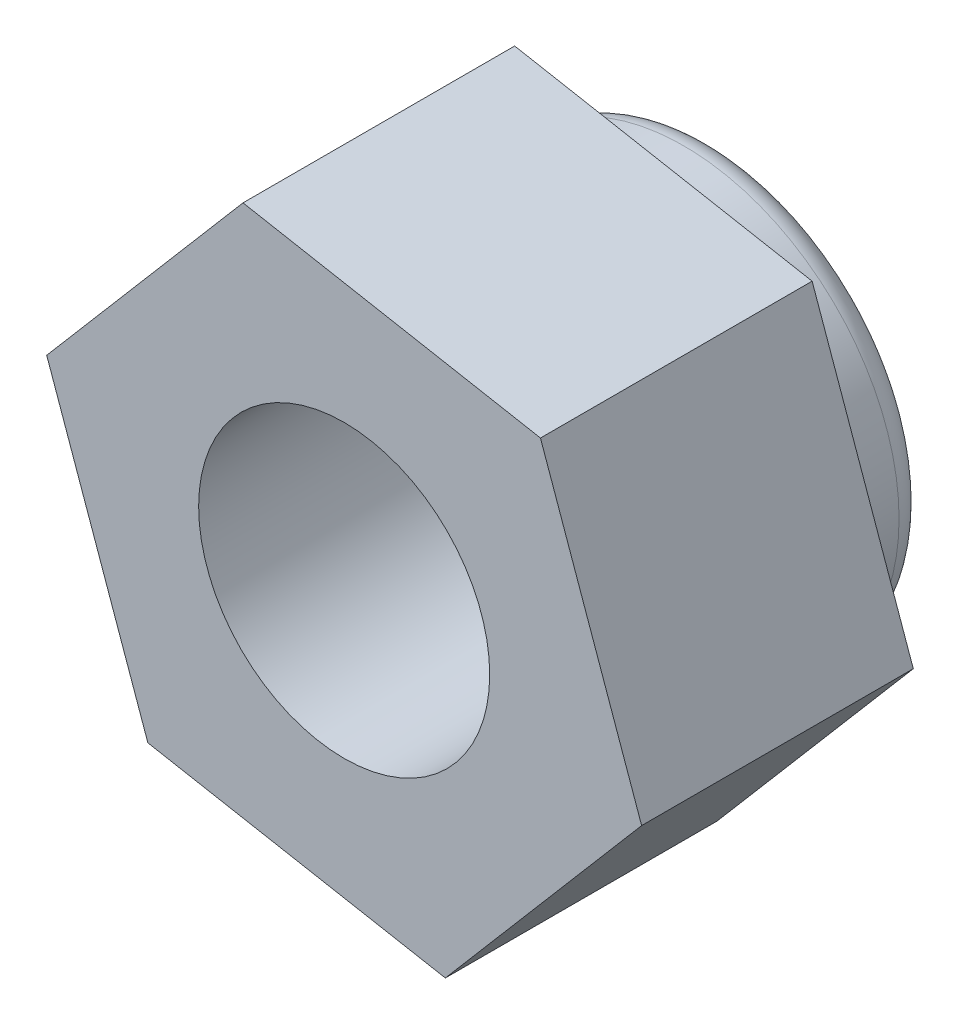
ISO-10303-21;
HEADER;
FILE_DESCRIPTION(('STEP AP214'),'2;1');
FILE_NAME('part.step','',(''),(''),'','','');
FILE_SCHEMA(('AUTOMOTIVE_DESIGN { 1 0 10303 214 1 1 1 1 }'));
ENDSEC;
DATA;
#1=APPLICATION_CONTEXT('core data for automotive mechanical design processes');
#2=APPLICATION_PROTOCOL_DEFINITION('international standard','automotive_design',2000,#1);
#3=PRODUCT_CONTEXT('',#1,'mechanical');
#4=PRODUCT('Part','Part','',(#3));
#5=PRODUCT_RELATED_PRODUCT_CATEGORY('part','',(#4));
#6=PRODUCT_DEFINITION_FORMATION('','',#4);
#7=PRODUCT_DEFINITION_CONTEXT('part definition',#1,'design');
#8=PRODUCT_DEFINITION('design','',#6,#7);
#9=PRODUCT_DEFINITION_SHAPE('','',#8);
#10=(LENGTH_UNIT() NAMED_UNIT(*) SI_UNIT(.MILLI.,.METRE.));
#11=(NAMED_UNIT(*) PLANE_ANGLE_UNIT() SI_UNIT($,.RADIAN.));
#12=(NAMED_UNIT(*) SI_UNIT($,.STERADIAN.) SOLID_ANGLE_UNIT());
#13=UNCERTAINTY_MEASURE_WITH_UNIT(LENGTH_MEASURE(1.E-05),#10,'distance_accuracy_value','');
#14=(GEOMETRIC_REPRESENTATION_CONTEXT(3) GLOBAL_UNCERTAINTY_ASSIGNED_CONTEXT((#13)) GLOBAL_UNIT_ASSIGNED_CONTEXT((#10,
#11,#12)) REPRESENTATION_CONTEXT('',''));
#15=CARTESIAN_POINT('',(0.,0.,0.));
#16=DIRECTION('',(0.,0.,1.));
#17=DIRECTION('',(1.,0.,0.));
#18=AXIS2_PLACEMENT_3D('',#15,#16,#17);
#19=CARTESIAN_POINT('',(0.,0.,0.));
#20=DIRECTION('',(0.,0.,1.));
#21=DIRECTION('',(1.,0.,0.));
#22=AXIS2_PLACEMENT_3D('',#19,#20,#21);
#23=PLANE('',#22);
#24=CARTESIAN_POINT('',(0.,0.,0.));
#25=DIRECTION('',(0.,0.,1.));
#26=DIRECTION('',(1.,0.,0.));
#27=AXIS2_PLACEMENT_3D('',#24,#25,#26);
#28=CIRCLE('',#27,1.91923847399192);
#29=CARTESIAN_POINT('',(1.91923847399192,0.,0.));
#30=VERTEX_POINT('',#29);
#31=EDGE_CURVE('E47',#30,#30,#28,.F.);
#32=ORIENTED_EDGE('',*,*,#31,.T.);
#33=EDGE_LOOP('',(#32));
#34=FACE_BOUND('',#33,.T.);
#35=CARTESIAN_POINT('',(0.,0.,0.));
#36=DIRECTION('',(0.,0.,1.));
#37=DIRECTION('',(1.,0.,0.));
#38=AXIS2_PLACEMENT_3D('',#35,#36,#37);
#39=CIRCLE('',#38,1.5);
#40=CARTESIAN_POINT('',(-1.5,0.,0.));
#41=VERTEX_POINT('',#40);
#42=EDGE_CURVE('E193',#41,#41,#39,.T.);
#43=ORIENTED_EDGE('',*,*,#42,.T.);
#44=EDGE_LOOP('',(#43));
#45=FACE_BOUND('',#44,.T.);
#46=ADVANCED_FACE('F39',(#34,#45),#23,.F.);
#47=CARTESIAN_POINT('',(2.0231883099042,2.3720685198086,3.8));
#48=DIRECTION('',(-0.181576086515687,-0.983376898653638,0.));
#49=DIRECTION('',(0.983376898653638,-0.181576086515687,0.));
#50=AXIS2_PLACEMENT_3D('',#47,#48,#49);
#51=PLANE('',#50);
#52=DIRECTION('',(0.983376898653638,-0.181576086515687,0.));
#53=VECTOR('',#52,1.);
#54=CARTESIAN_POINT('',(2.0231883099042,2.3720685198086,1.));
#55=LINE('',#54,#53);
#56=CARTESIAN_POINT('',(-1.0426774427195,2.93816673292105,1.));
#57=VERTEX_POINT('',#56);
#58=CARTESIAN_POINT('',(2.0231883099042,2.3720685198086,1.));
#59=VERTEX_POINT('',#58);
#60=EDGE_CURVE('E54',#57,#59,#55,.T.);
#61=ORIENTED_EDGE('',*,*,#60,.F.);
#62=DIRECTION('',(0.,0.,-1.));
#63=VECTOR('',#62,1.);
#64=CARTESIAN_POINT('',(-1.0426774427195,2.93816673292105,3.8));
#65=LINE('',#64,#63);
#66=CARTESIAN_POINT('',(-1.0426774427195,2.93816673292105,3.8));
#67=VERTEX_POINT('',#66);
#68=EDGE_CURVE('E98',#67,#57,#65,.T.);
#69=ORIENTED_EDGE('',*,*,#68,.F.);
#70=DIRECTION('',(-0.983376898653638,0.181576086515687,0.));
#71=VECTOR('',#70,1.);
#72=CARTESIAN_POINT('',(2.0231883099042,2.3720685198086,3.8));
#73=LINE('',#72,#71);
#74=CARTESIAN_POINT('',(2.0231883099042,2.3720685198086,3.8));
#75=VERTEX_POINT('',#74);
#76=EDGE_CURVE('E183',#75,#67,#73,.T.);
#77=ORIENTED_EDGE('',*,*,#76,.F.);
#78=DIRECTION('',(0.,0.,-1.));
#79=VECTOR('',#78,1.);
#80=CARTESIAN_POINT('',(2.0231883099042,2.3720685198086,3.8));
#81=LINE('',#80,#79);
#82=EDGE_CURVE('E112',#75,#59,#81,.T.);
#83=ORIENTED_EDGE('',*,*,#82,.T.);
#84=EDGE_LOOP('',(#61,#69,#77,#83));
#85=FACE_BOUND('',#84,.T.);
#86=ADVANCED_FACE('F140',(#85),#51,.F.);
#87=CARTESIAN_POINT('',(-1.0426774427195,2.93816673292105,3.8));
#88=DIRECTION('',(0.760841332470963,-0.648937952969165,0.));
#89=DIRECTION('',(0.648937952969165,0.760841332470963,0.));
#90=AXIS2_PLACEMENT_3D('',#87,#88,#89);
#91=PLANE('',#90);
#92=DIRECTION('',(0.648937952969165,0.760841332470963,0.));
#93=VECTOR('',#92,1.);
#94=CARTESIAN_POINT('',(-1.0426774427195,2.93816673292105,1.));
#95=LINE('',#94,#93);
#96=CARTESIAN_POINT('',(-3.0658657526237,0.566098213112445,1.));
#97=VERTEX_POINT('',#96);
#98=EDGE_CURVE('E169',#97,#57,#95,.T.);
#99=ORIENTED_EDGE('',*,*,#98,.F.);
#100=DIRECTION('',(0.,0.,-1.));
#101=VECTOR('',#100,1.);
#102=CARTESIAN_POINT('',(-3.0658657526237,0.566098213112445,3.8));
#103=LINE('',#102,#101);
#104=CARTESIAN_POINT('',(-3.0658657526237,0.566098213112445,3.8));
#105=VERTEX_POINT('',#104);
#106=EDGE_CURVE('E121',#105,#97,#103,.T.);
#107=ORIENTED_EDGE('',*,*,#106,.F.);
#108=DIRECTION('',(-0.648937952969165,-0.760841332470963,0.));
#109=VECTOR('',#108,1.);
#110=CARTESIAN_POINT('',(-1.0426774427195,2.93816673292105,3.8));
#111=LINE('',#110,#109);
#112=EDGE_CURVE('E179',#67,#105,#111,.T.);
#113=ORIENTED_EDGE('',*,*,#112,.F.);
#114=ORIENTED_EDGE('',*,*,#68,.T.);
#115=EDGE_LOOP('',(#99,#107,#113,#114));
#116=FACE_BOUND('',#115,.T.);
#117=ADVANCED_FACE('F145',(#116),#91,.F.);
#118=CARTESIAN_POINT('',(-3.0658657526237,0.566098213112445,3.8));
#119=DIRECTION('',(0.942417418986649,0.334438945684473,0.));
#120=DIRECTION('',(-0.334438945684473,0.94241741898665,0.));
#121=AXIS2_PLACEMENT_3D('',#118,#119,#120);
#122=PLANE('',#121);
#123=DIRECTION('',(-0.334438945684473,0.94241741898665,0.));
#124=VECTOR('',#123,1.);
#125=CARTESIAN_POINT('',(-3.0658657526237,0.566098213112445,1.));
#126=LINE('',#125,#124);
#127=CARTESIAN_POINT('',(-2.02318830990421,-2.3720685198086,1.));
#128=VERTEX_POINT('',#127);
#129=EDGE_CURVE('E172',#128,#97,#126,.T.);
#130=ORIENTED_EDGE('',*,*,#129,.F.);
#131=DIRECTION('',(0.,0.,-1.));
#132=VECTOR('',#131,1.);
#133=CARTESIAN_POINT('',(-2.02318830990421,-2.3720685198086,3.8));
#134=LINE('',#133,#132);
#135=CARTESIAN_POINT('',(-2.02318830990421,-2.3720685198086,3.8));
#136=VERTEX_POINT('',#135);
#137=EDGE_CURVE('E114',#136,#128,#134,.T.);
#138=ORIENTED_EDGE('',*,*,#137,.F.);
#139=DIRECTION('',(0.334438945684473,-0.942417418986649,0.));
#140=VECTOR('',#139,1.);
#141=CARTESIAN_POINT('',(-3.0658657526237,0.566098213112445,3.8));
#142=LINE('',#141,#140);
#143=EDGE_CURVE('E176',#105,#136,#142,.T.);
#144=ORIENTED_EDGE('',*,*,#143,.F.);
#145=ORIENTED_EDGE('',*,*,#106,.T.);
#146=EDGE_LOOP('',(#130,#138,#144,#145));
#147=FACE_BOUND('',#146,.T.);
#148=ADVANCED_FACE('F158',(#147),#122,.F.);
#149=CARTESIAN_POINT('',(-2.02318830990421,-2.3720685198086,3.8));
#150=DIRECTION('',(0.181576086515687,0.983376898653638,0.));
#151=DIRECTION('',(-0.983376898653638,0.181576086515687,0.));
#152=AXIS2_PLACEMENT_3D('',#149,#150,#151);
#153=PLANE('',#152);
#154=DIRECTION('',(-0.983376898653638,0.181576086515687,0.));
#155=VECTOR('',#154,1.);
#156=CARTESIAN_POINT('',(-2.02318830990421,-2.3720685198086,1.));
#157=LINE('',#156,#155);
#158=CARTESIAN_POINT('',(1.0426774427195,-2.93816673292105,1.));
#159=VERTEX_POINT('',#158);
#160=EDGE_CURVE('E108',#159,#128,#157,.T.);
#161=ORIENTED_EDGE('',*,*,#160,.F.);
#162=DIRECTION('',(0.,0.,-1.));
#163=VECTOR('',#162,1.);
#164=CARTESIAN_POINT('',(1.0426774427195,-2.93816673292105,3.8));
#165=LINE('',#164,#163);
#166=CARTESIAN_POINT('',(1.0426774427195,-2.93816673292105,3.8));
#167=VERTEX_POINT('',#166);
#168=EDGE_CURVE('E107',#167,#159,#165,.T.);
#169=ORIENTED_EDGE('',*,*,#168,.F.);
#170=DIRECTION('',(0.983376898653638,-0.181576086515687,0.));
#171=VECTOR('',#170,1.);
#172=CARTESIAN_POINT('',(-2.02318830990421,-2.3720685198086,3.8));
#173=LINE('',#172,#171);
#174=EDGE_CURVE('E178',#136,#167,#173,.T.);
#175=ORIENTED_EDGE('',*,*,#174,.F.);
#176=ORIENTED_EDGE('',*,*,#137,.T.);
#177=EDGE_LOOP('',(#161,#169,#175,#176));
#178=FACE_BOUND('',#177,.T.);
#179=ADVANCED_FACE('F155',(#178),#153,.F.);
#180=CARTESIAN_POINT('',(1.0426774427195,-2.93816673292105,3.8));
#181=DIRECTION('',(-0.760841332470963,0.648937952969165,0.));
#182=DIRECTION('',(-0.648937952969165,-0.760841332470963,0.));
#183=AXIS2_PLACEMENT_3D('',#180,#181,#182);
#184=PLANE('',#183);
#185=DIRECTION('',(-0.648937952969165,-0.760841332470963,0.));
#186=VECTOR('',#185,1.);
#187=CARTESIAN_POINT('',(1.0426774427195,-2.93816673292105,1.));
#188=LINE('',#187,#186);
#189=CARTESIAN_POINT('',(3.0658657526237,-0.566098213112445,1.));
#190=VERTEX_POINT('',#189);
#191=EDGE_CURVE('E93',#190,#159,#188,.T.);
#192=ORIENTED_EDGE('',*,*,#191,.F.);
#193=DIRECTION('',(0.,0.,-1.));
#194=VECTOR('',#193,1.);
#195=CARTESIAN_POINT('',(3.0658657526237,-0.566098213112445,3.8));
#196=LINE('',#195,#194);
#197=CARTESIAN_POINT('',(3.0658657526237,-0.566098213112445,3.8));
#198=VERTEX_POINT('',#197);
#199=EDGE_CURVE('E105',#198,#190,#196,.T.);
#200=ORIENTED_EDGE('',*,*,#199,.F.);
#201=DIRECTION('',(0.648937952969165,0.760841332470963,0.));
#202=VECTOR('',#201,1.);
#203=CARTESIAN_POINT('',(1.0426774427195,-2.93816673292105,3.8));
#204=LINE('',#203,#202);
#205=EDGE_CURVE('E181',#167,#198,#204,.T.);
#206=ORIENTED_EDGE('',*,*,#205,.F.);
#207=ORIENTED_EDGE('',*,*,#168,.T.);
#208=EDGE_LOOP('',(#192,#200,#206,#207));
#209=FACE_BOUND('',#208,.T.);
#210=ADVANCED_FACE('F103',(#209),#184,.F.);
#211=CARTESIAN_POINT('',(3.0658657526237,-0.566098213112445,3.8));
#212=DIRECTION('',(-0.942417418986649,-0.334438945684473,0.));
#213=DIRECTION('',(0.334438945684473,-0.94241741898665,0.));
#214=AXIS2_PLACEMENT_3D('',#211,#212,#213);
#215=PLANE('',#214);
#216=DIRECTION('',(0.334438945684473,-0.94241741898665,0.));
#217=VECTOR('',#216,1.);
#218=CARTESIAN_POINT('',(3.0658657526237,-0.566098213112445,1.));
#219=LINE('',#218,#217);
#220=EDGE_CURVE('E90',#59,#190,#219,.T.);
#221=ORIENTED_EDGE('',*,*,#220,.F.);
#222=ORIENTED_EDGE('',*,*,#82,.F.);
#223=DIRECTION('',(-0.334438945684473,0.942417418986649,0.));
#224=VECTOR('',#223,1.);
#225=CARTESIAN_POINT('',(3.0658657526237,-0.566098213112445,3.8));
#226=LINE('',#225,#224);
#227=EDGE_CURVE('E62',#198,#75,#226,.T.);
#228=ORIENTED_EDGE('',*,*,#227,.F.);
#229=ORIENTED_EDGE('',*,*,#199,.T.);
#230=EDGE_LOOP('',(#221,#222,#228,#229));
#231=FACE_BOUND('',#230,.T.);
#232=ADVANCED_FACE('F111',(#231),#215,.F.);
#233=CARTESIAN_POINT('',(0.,0.,3.8));
#234=DIRECTION('',(0.,0.,1.));
#235=DIRECTION('',(1.,0.,0.));
#236=AXIS2_PLACEMENT_3D('',#233,#234,#235);
#237=PLANE('',#236);
#238=ORIENTED_EDGE('',*,*,#76,.T.);
#239=ORIENTED_EDGE('',*,*,#112,.T.);
#240=ORIENTED_EDGE('',*,*,#143,.T.);
#241=ORIENTED_EDGE('',*,*,#174,.T.);
#242=ORIENTED_EDGE('',*,*,#205,.T.);
#243=ORIENTED_EDGE('',*,*,#227,.T.);
#244=EDGE_LOOP('',(#238,#239,#240,#241,#242,#243));
#245=FACE_BOUND('',#244,.T.);
#246=CARTESIAN_POINT('',(0.,0.,3.8));
#247=DIRECTION('',(0.,0.,1.));
#248=DIRECTION('',(1.,0.,0.));
#249=AXIS2_PLACEMENT_3D('',#246,#247,#248);
#250=CIRCLE('',#249,1.5);
#251=CARTESIAN_POINT('',(-1.5,0.,3.8));
#252=VERTEX_POINT('',#251);
#253=EDGE_CURVE('E194',#252,#252,#250,.T.);
#254=ORIENTED_EDGE('',*,*,#253,.F.);
#255=EDGE_LOOP('',(#254));
#256=FACE_BOUND('',#255,.T.);
#257=ADVANCED_FACE('F149',(#245,#256),#237,.T.);
#258=CARTESIAN_POINT('',(0.,0.,3.8));
#259=DIRECTION('',(0.,0.,-1.));
#260=DIRECTION('',(-1.,0.,0.));
#261=AXIS2_PLACEMENT_3D('',#258,#259,#260);
#262=CYLINDRICAL_SURFACE('',#261,1.5);
#263=CARTESIAN_POINT('',(-1.5,0.,3.8));
#264=CARTESIAN_POINT('',(-1.5,0.,3.76041666666667));
#265=CARTESIAN_POINT('',(-1.5,0.,3.72083333333333));
#266=CARTESIAN_POINT('',(-1.5,0.,3.64166666666667));
#267=CARTESIAN_POINT('',(-1.5,0.,3.60208333333333));
#268=CARTESIAN_POINT('',(-1.5,0.,3.52291666666667));
#269=CARTESIAN_POINT('',(-1.5,0.,3.48333333333333));
#270=CARTESIAN_POINT('',(-1.5,0.,3.40416666666667));
#271=CARTESIAN_POINT('',(-1.5,0.,3.36458333333333));
#272=CARTESIAN_POINT('',(-1.5,0.,3.28541666666667));
#273=CARTESIAN_POINT('',(-1.5,0.,3.24583333333333));
#274=CARTESIAN_POINT('',(-1.5,0.,3.16666666666667));
#275=CARTESIAN_POINT('',(-1.5,0.,3.12708333333333));
#276=CARTESIAN_POINT('',(-1.5,0.,3.04791666666667));
#277=CARTESIAN_POINT('',(-1.5,0.,3.00833333333333));
#278=CARTESIAN_POINT('',(-1.5,0.,2.92916666666667));
#279=CARTESIAN_POINT('',(-1.5,0.,2.88958333333333));
#280=CARTESIAN_POINT('',(-1.5,0.,2.81041666666667));
#281=CARTESIAN_POINT('',(-1.5,0.,2.77083333333333));
#282=CARTESIAN_POINT('',(-1.5,0.,2.69166666666667));
#283=CARTESIAN_POINT('',(-1.5,0.,2.65208333333333));
#284=CARTESIAN_POINT('',(-1.5,0.,2.57291666666667));
#285=CARTESIAN_POINT('',(-1.5,0.,2.53333333333333));
#286=CARTESIAN_POINT('',(-1.5,0.,2.45416666666667));
#287=CARTESIAN_POINT('',(-1.5,0.,2.41458333333333));
#288=CARTESIAN_POINT('',(-1.5,0.,2.33541666666667));
#289=CARTESIAN_POINT('',(-1.5,0.,2.29583333333333));
#290=CARTESIAN_POINT('',(-1.5,0.,2.21666666666667));
#291=CARTESIAN_POINT('',(-1.5,0.,2.17708333333333));
#292=CARTESIAN_POINT('',(-1.5,0.,2.09791666666667));
#293=CARTESIAN_POINT('',(-1.5,0.,2.05833333333333));
#294=CARTESIAN_POINT('',(-1.5,0.,1.97916666666667));
#295=CARTESIAN_POINT('',(-1.5,0.,1.93958333333333));
#296=CARTESIAN_POINT('',(-1.5,0.,1.86041666666667));
#297=CARTESIAN_POINT('',(-1.5,0.,1.82083333333333));
#298=CARTESIAN_POINT('',(-1.5,0.,1.74166666666667));
#299=CARTESIAN_POINT('',(-1.5,0.,1.70208333333333));
#300=CARTESIAN_POINT('',(-1.5,0.,1.62291666666667));
#301=CARTESIAN_POINT('',(-1.5,0.,1.58333333333333));
#302=CARTESIAN_POINT('',(-1.5,0.,1.50416666666667));
#303=CARTESIAN_POINT('',(-1.5,0.,1.46458333333333));
#304=CARTESIAN_POINT('',(-1.5,0.,1.38541666666667));
#305=CARTESIAN_POINT('',(-1.5,0.,1.34583333333333));
#306=CARTESIAN_POINT('',(-1.5,0.,1.26666666666667));
#307=CARTESIAN_POINT('',(-1.5,0.,1.22708333333333));
#308=CARTESIAN_POINT('',(-1.5,0.,1.14791666666667));
#309=CARTESIAN_POINT('',(-1.5,0.,1.10833333333333));
#310=CARTESIAN_POINT('',(-1.5,0.,1.02916666666667));
#311=CARTESIAN_POINT('',(-1.5,0.,0.989583333333333));
#312=CARTESIAN_POINT('',(-1.5,0.,0.910416666666667));
#313=CARTESIAN_POINT('',(-1.5,0.,0.870833333333333));
#314=CARTESIAN_POINT('',(-1.5,0.,0.791666666666667));
#315=CARTESIAN_POINT('',(-1.5,0.,0.752083333333333));
#316=CARTESIAN_POINT('',(-1.5,0.,0.672916666666667));
#317=CARTESIAN_POINT('',(-1.5,0.,0.633333333333333));
#318=CARTESIAN_POINT('',(-1.5,0.,0.554166666666667));
#319=CARTESIAN_POINT('',(-1.5,0.,0.514583333333334));
#320=CARTESIAN_POINT('',(-1.5,0.,0.435416666666667));
#321=CARTESIAN_POINT('',(-1.5,0.,0.395833333333333));
#322=CARTESIAN_POINT('',(-1.5,0.,0.316666666666666));
#323=CARTESIAN_POINT('',(-1.5,0.,0.277083333333333));
#324=CARTESIAN_POINT('',(-1.5,0.,0.197916666666667));
#325=CARTESIAN_POINT('',(-1.5,0.,0.158333333333333));
#326=CARTESIAN_POINT('',(-1.5,0.,0.0791666666666666));
#327=CARTESIAN_POINT('',(-1.5,0.,0.0395833333333333));
#328=CARTESIAN_POINT('',(-1.5,0.,0.));
#329=B_SPLINE_CURVE_WITH_KNOTS('',3,(#263,#264,#265,#266,#267,#268,#269,#270,#271,#272,#273,
#274,#275,#276,#277,#278,#279,#280,#281,#282,#283,#284,#285,#286,#287,#288,#289,#290,#291,#292,
#293,#294,#295,#296,#297,#298,#299,#300,#301,#302,#303,#304,#305,#306,#307,#308,#309,#310,#311,
#312,#313,#314,#315,#316,#317,#318,#319,#320,#321,#322,#323,#324,#325,#326,#327,#328),
.UNSPECIFIED.,.F.,.F.,(4,2,2,2,2,2,2,2,2,2,2,2,2,2,2,2,2,2,2,2,2,2,2,2,2,2,2,2,2,2,2,2,4),(0.,
0.11875,0.2375,0.35625,0.475,0.59375,0.7125,0.831249999999999,0.95,1.06875,1.1875,1.30625,1.425,
1.54375,1.6625,1.78125,1.9,2.01875,2.1375,2.25625,2.375,2.49375,2.6125,2.73125,2.85,2.96875,
3.0875,3.20625,3.325,3.44375,3.5625,3.68125,3.8),.UNSPECIFIED.);
#330=EDGE_CURVE('BSEAM201',#252,#41,#329,.T.);
#331=ORIENTED_EDGE('',*,*,#253,.T.);
#332=ORIENTED_EDGE('',*,*,#42,.F.);
#333=ORIENTED_EDGE('',*,*,#330,.T.);
#334=ORIENTED_EDGE('',*,*,#330,.F.);
#335=EDGE_LOOP('',(#331,#333,#332,#334));
#336=FACE_BOUND('',#335,.T.);
#337=ADVANCED_FACE('F201',(#336),#262,.F.);
#338=CARTESIAN_POINT('',(0.,0.,1.));
#339=DIRECTION('',(0.,0.,-1.));
#340=DIRECTION('',(-1.,0.,0.));
#341=AXIS2_PLACEMENT_3D('',#338,#339,#340);
#342=PLANE('',#341);
#343=CARTESIAN_POINT('',(0.,0.,1.));
#344=DIRECTION('',(0.,0.,-1.));
#345=DIRECTION('',(-1.,0.,0.));
#346=AXIS2_PLACEMENT_3D('',#343,#344,#345);
#347=CIRCLE('',#346,2.21923847399192);
#348=CARTESIAN_POINT('',(-2.21923847399192,0.,1.));
#349=VERTEX_POINT('',#348);
#350=EDGE_CURVE('E109',#349,#349,#347,.T.);
#351=ORIENTED_EDGE('',*,*,#350,.F.);
#352=EDGE_LOOP('',(#351));
#353=FACE_BOUND('',#352,.T.);
#354=ORIENTED_EDGE('',*,*,#60,.T.);
#355=ORIENTED_EDGE('',*,*,#220,.T.);
#356=ORIENTED_EDGE('',*,*,#191,.T.);
#357=ORIENTED_EDGE('',*,*,#160,.T.);
#358=ORIENTED_EDGE('',*,*,#129,.T.);
#359=ORIENTED_EDGE('',*,*,#98,.T.);
#360=EDGE_LOOP('',(#354,#355,#356,#357,#358,#359));
#361=FACE_BOUND('',#360,.T.);
#362=ADVANCED_FACE('F92',(#353,#361),#342,.T.);
#363=CARTESIAN_POINT('',(0.,0.,1.));
#364=DIRECTION('',(0.,0.,-1.));
#365=DIRECTION('',(-1.,0.,0.));
#366=AXIS2_PLACEMENT_3D('',#363,#364,#365);
#367=CYLINDRICAL_SURFACE('',#366,2.21923847399192);
#368=CARTESIAN_POINT('',(0.,0.,0.3));
#369=DIRECTION('',(0.,0.,1.));
#370=DIRECTION('',(1.,0.,0.));
#371=AXIS2_PLACEMENT_3D('',#368,#369,#370);
#372=CIRCLE('',#371,2.21923847399192);
#373=CARTESIAN_POINT('',(2.21923847399192,0.,0.3));
#374=VERTEX_POINT('',#373);
#375=EDGE_CURVE('E12',#374,#374,#372,.T.);
#376=ORIENTED_EDGE('',*,*,#375,.T.);
#377=EDGE_LOOP('',(#376));
#378=FACE_BOUND('',#377,.T.);
#379=ORIENTED_EDGE('',*,*,#350,.T.);
#380=EDGE_LOOP('',(#379));
#381=FACE_BOUND('',#380,.T.);
#382=ADVANCED_FACE('F131',(#378,#381),#367,.T.);
#383=CARTESIAN_POINT('',(0.,0.,0.3));
#384=DIRECTION('',(0.,0.,1.));
#385=DIRECTION('',(1.,0.,0.));
#386=AXIS2_PLACEMENT_3D('',#383,#384,#385);
#387=TOROIDAL_SURFACE('',#386,1.91923847399192,0.3);
#388=ORIENTED_EDGE('',*,*,#375,.F.);
#389=EDGE_LOOP('',(#388));
#390=FACE_BOUND('',#389,.T.);
#391=ORIENTED_EDGE('',*,*,#31,.F.);
#392=EDGE_LOOP('',(#391));
#393=FACE_BOUND('',#392,.T.);
#394=ADVANCED_FACE('F41',(#390,#393),#387,.T.);
#395=CLOSED_SHELL('',(#46,#86,#117,#148,#179,#210,#232,#257,#337,#362,#382,#394));
#396=MANIFOLD_SOLID_BREP('B2',#395);
#397=ADVANCED_BREP_SHAPE_REPRESENTATION('',(#18,#396),#14);
#398=SHAPE_DEFINITION_REPRESENTATION(#9,#397);
ENDSEC;
END-ISO-10303-21;
